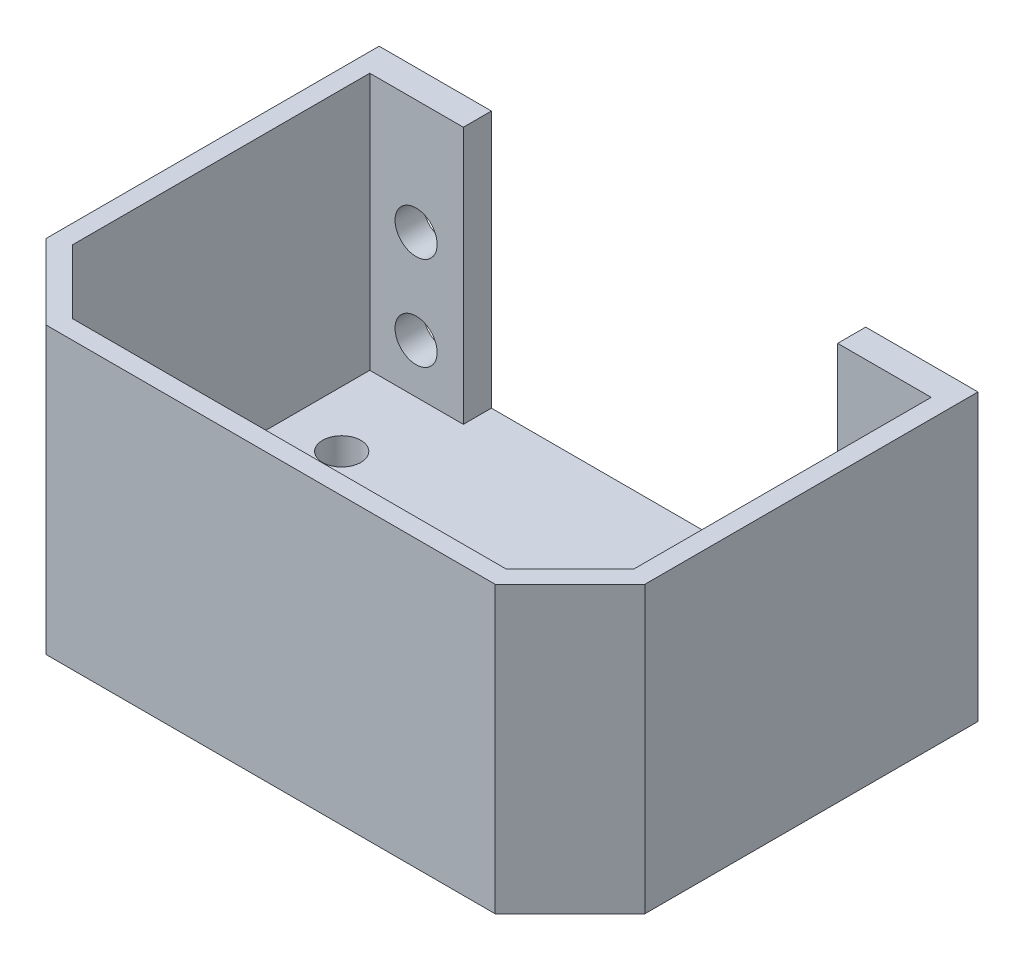
ISO-10303-21;
HEADER;
FILE_DESCRIPTION(('STEP AP214'),'2;1');
FILE_NAME('part.step','',(''),(''),'','','');
FILE_SCHEMA(('AUTOMOTIVE_DESIGN { 1 0 10303 214 1 1 1 1 }'));
ENDSEC;
DATA;
#1=APPLICATION_CONTEXT('core data for automotive mechanical design processes');
#2=APPLICATION_PROTOCOL_DEFINITION('international standard','automotive_design',2000,#1);
#3=PRODUCT_CONTEXT('',#1,'mechanical');
#4=PRODUCT('Part','Part','',(#3));
#5=PRODUCT_RELATED_PRODUCT_CATEGORY('part','',(#4));
#6=PRODUCT_DEFINITION_FORMATION('','',#4);
#7=PRODUCT_DEFINITION_CONTEXT('part definition',#1,'design');
#8=PRODUCT_DEFINITION('design','',#6,#7);
#9=PRODUCT_DEFINITION_SHAPE('','',#8);
#10=(LENGTH_UNIT() NAMED_UNIT(*) SI_UNIT(.MILLI.,.METRE.));
#11=(NAMED_UNIT(*) PLANE_ANGLE_UNIT() SI_UNIT($,.RADIAN.));
#12=(NAMED_UNIT(*) SI_UNIT($,.STERADIAN.) SOLID_ANGLE_UNIT());
#13=UNCERTAINTY_MEASURE_WITH_UNIT(LENGTH_MEASURE(1.E-05),#10,'distance_accuracy_value','');
#14=(GEOMETRIC_REPRESENTATION_CONTEXT(3) GLOBAL_UNCERTAINTY_ASSIGNED_CONTEXT((#13)) GLOBAL_UNIT_ASSIGNED_CONTEXT((#10,
#11,#12)) REPRESENTATION_CONTEXT('',''));
#15=CARTESIAN_POINT('',(0.,0.,0.));
#16=DIRECTION('',(0.,0.,1.));
#17=DIRECTION('',(1.,0.,0.));
#18=AXIS2_PLACEMENT_3D('',#15,#16,#17);
#19=CARTESIAN_POINT('',(32.,-10.25,28.));
#20=DIRECTION('',(0.,1.,0.));
#21=DIRECTION('',(0.,0.,1.));
#22=AXIS2_PLACEMENT_3D('',#19,#20,#21);
#23=PLANE('',#22);
#24=DIRECTION('',(0.,0.,-1.));
#25=VECTOR('',#24,1.);
#26=CARTESIAN_POINT('',(28.,-10.25,28.));
#27=LINE('',#26,#25);
#28=CARTESIAN_POINT('',(28.,-10.25,26.5142135623731));
#29=VERTEX_POINT('',#28);
#30=CARTESIAN_POINT('',(28.,-10.25,18.1));
#31=VERTEX_POINT('',#30);
#32=EDGE_CURVE('E369',#29,#31,#27,.T.);
#33=ORIENTED_EDGE('',*,*,#32,.F.);
#34=DIRECTION('',(0.707106781186544,0.,-0.70710678118655));
#35=VECTOR('',#34,1.);
#36=CARTESIAN_POINT('',(28.,-10.25,26.5142135623731));
#37=LINE('',#36,#35);
#38=CARTESIAN_POINT('',(25.9142135623731,-10.25,28.6));
#39=VERTEX_POINT('',#38);
#40=EDGE_CURVE('E324',#39,#29,#37,.T.);
#41=ORIENTED_EDGE('',*,*,#40,.F.);
#42=DIRECTION('',(1.,0.,0.));
#43=VECTOR('',#42,1.);
#44=CARTESIAN_POINT('',(25.9142135623731,-10.25,28.6));
#45=LINE('',#44,#43);
#46=CARTESIAN_POINT('',(-5.91421356237307,-10.25,28.6));
#47=VERTEX_POINT('',#46);
#48=EDGE_CURVE('E320',#47,#39,#45,.T.);
#49=ORIENTED_EDGE('',*,*,#48,.F.);
#50=DIRECTION('',(0.70710678118655,0.,0.707106781186545));
#51=VECTOR('',#50,1.);
#52=CARTESIAN_POINT('',(-5.91421356237307,-10.25,28.6));
#53=LINE('',#52,#51);
#54=CARTESIAN_POINT('',(-8.,-10.25,26.5142135623731));
#55=VERTEX_POINT('',#54);
#56=EDGE_CURVE('E316',#55,#47,#53,.T.);
#57=ORIENTED_EDGE('',*,*,#56,.F.);
#58=DIRECTION('',(0.,0.,1.));
#59=VECTOR('',#58,1.);
#60=CARTESIAN_POINT('',(-8.,-10.25,28.));
#61=LINE('',#60,#59);
#62=CARTESIAN_POINT('',(-8.,-10.25,18.1));
#63=VERTEX_POINT('',#62);
#64=EDGE_CURVE('E373',#63,#55,#61,.T.);
#65=ORIENTED_EDGE('',*,*,#64,.F.);
#66=DIRECTION('',(0.707106781186543,0.,-0.707106781186552));
#67=VECTOR('',#66,1.);
#68=CARTESIAN_POINT('',(-8.,-10.25,18.1));
#69=LINE('',#68,#67);
#70=CARTESIAN_POINT('',(-5.5,-10.25,15.6));
#71=VERTEX_POINT('',#70);
#72=EDGE_CURVE('E497',#63,#71,#69,.T.);
#73=ORIENTED_EDGE('',*,*,#72,.T.);
#74=DIRECTION('',(1.,0.,0.));
#75=VECTOR('',#74,1.);
#76=CARTESIAN_POINT('',(28.,-10.25,15.6));
#77=LINE('',#76,#75);
#78=CARTESIAN_POINT('',(25.5,-10.25,15.6));
#79=VERTEX_POINT('',#78);
#80=EDGE_CURVE('E351',#71,#79,#77,.T.);
#81=ORIENTED_EDGE('',*,*,#80,.T.);
#82=DIRECTION('',(0.707106781186551,0.,0.707106781186544));
#83=VECTOR('',#82,1.);
#84=CARTESIAN_POINT('',(25.5,-10.25,15.6));
#85=LINE('',#84,#83);
#86=EDGE_CURVE('E503',#79,#31,#85,.T.);
#87=ORIENTED_EDGE('',*,*,#86,.T.);
#88=EDGE_LOOP('',(#33,#41,#49,#57,#65,#73,#81,#87));
#89=FACE_BOUND('',#88,.T.);
#90=CARTESIAN_POINT('',(-24.,-10.25,31.6));
#91=DIRECTION('',(0.,-1.,0.));
#92=DIRECTION('',(0.,0.,-1.));
#93=AXIS2_PLACEMENT_3D('',#90,#91,#92);
#94=CIRCLE('',#93,2.05);
#95=CARTESIAN_POINT('',(-24.,-10.25,29.55));
#96=VERTEX_POINT('',#95);
#97=EDGE_CURVE('E343',#96,#96,#94,.T.);
#98=ORIENTED_EDGE('',*,*,#97,.T.);
#99=EDGE_LOOP('',(#98));
#100=FACE_BOUND('',#99,.T.);
#101=CARTESIAN_POINT('',(24.,-10.25,33.6));
#102=DIRECTION('',(0.,-1.,0.));
#103=DIRECTION('',(0.,0.,-1.));
#104=AXIS2_PLACEMENT_3D('',#101,#102,#103);
#105=CIRCLE('',#104,2.05);
#106=CARTESIAN_POINT('',(24.,-10.25,31.55));
#107=VERTEX_POINT('',#106);
#108=EDGE_CURVE('E333',#107,#107,#105,.T.);
#109=ORIENTED_EDGE('',*,*,#108,.T.);
#110=EDGE_LOOP('',(#109));
#111=FACE_BOUND('',#110,.T.);
#112=CARTESIAN_POINT('',(-24.,-10.25,12.));
#113=DIRECTION('',(0.,1.,0.));
#114=DIRECTION('',(0.,0.,1.));
#115=AXIS2_PLACEMENT_3D('',#112,#113,#114);
#116=CIRCLE('',#115,2.05);
#117=CARTESIAN_POINT('',(-24.,-10.25,14.05));
#118=VERTEX_POINT('',#117);
#119=EDGE_CURVE('E361',#118,#118,#116,.T.);
#120=ORIENTED_EDGE('',*,*,#119,.F.);
#121=EDGE_LOOP('',(#120));
#122=FACE_BOUND('',#121,.T.);
#123=CARTESIAN_POINT('',(24.,-10.25,10.));
#124=DIRECTION('',(0.,1.,0.));
#125=DIRECTION('',(0.,0.,1.));
#126=AXIS2_PLACEMENT_3D('',#123,#124,#125);
#127=CIRCLE('',#126,2.05);
#128=CARTESIAN_POINT('',(24.,-10.25,12.05));
#129=VERTEX_POINT('',#128);
#130=EDGE_CURVE('E360',#129,#129,#127,.T.);
#131=ORIENTED_EDGE('',*,*,#130,.F.);
#132=EDGE_LOOP('',(#131));
#133=FACE_BOUND('',#132,.T.);
#134=DIRECTION('',(-0.707106781187019,0.,0.707106781186076));
#135=VECTOR('',#134,1.);
#136=CARTESIAN_POINT('',(23.1715728752653,-10.25,41.6));
#137=LINE('',#136,#135);
#138=CARTESIAN_POINT('',(30.0000000000107,-10.25,34.7715728752637));
#139=VERTEX_POINT('',#138);
#140=CARTESIAN_POINT('',(23.1715728752653,-10.25,41.6));
#141=VERTEX_POINT('',#140);
#142=EDGE_CURVE('E301',#139,#141,#137,.T.);
#143=ORIENTED_EDGE('',*,*,#142,.F.);
#144=DIRECTION('',(0.,0.,1.));
#145=VECTOR('',#144,1.);
#146=CARTESIAN_POINT('',(30.,-10.25,28.));
#147=LINE('',#146,#145);
#148=CARTESIAN_POINT('',(30.,-10.25,3.));
#149=VERTEX_POINT('',#148);
#150=EDGE_CURVE('E61',#149,#139,#147,.T.);
#151=ORIENTED_EDGE('',*,*,#150,.F.);
#152=DIRECTION('',(-1.,0.,0.));
#153=VECTOR('',#152,1.);
#154=CARTESIAN_POINT('',(0.,-10.25,3.));
#155=LINE('',#154,#153);
#156=CARTESIAN_POINT('',(20.,-10.25,3.));
#157=VERTEX_POINT('',#156);
#158=EDGE_CURVE('E416',#149,#157,#155,.T.);
#159=ORIENTED_EDGE('',*,*,#158,.T.);
#160=DIRECTION('',(0.,0.,-1.));
#161=VECTOR('',#160,1.);
#162=CARTESIAN_POINT('',(20.,-10.25,3.));
#163=LINE('',#162,#161);
#164=CARTESIAN_POINT('',(20.,-10.25,0.));
#165=VERTEX_POINT('',#164);
#166=EDGE_CURVE('E419',#157,#165,#163,.T.);
#167=ORIENTED_EDGE('',*,*,#166,.T.);
#168=DIRECTION('',(1.,0.,0.));
#169=VECTOR('',#168,1.);
#170=CARTESIAN_POINT('',(32.,-10.25,0.));
#171=LINE('',#170,#169);
#172=CARTESIAN_POINT('',(-20.,-10.25,0.));
#173=VERTEX_POINT('',#172);
#174=EDGE_CURVE('E432',#173,#165,#171,.T.);
#175=ORIENTED_EDGE('',*,*,#174,.F.);
#176=DIRECTION('',(0.,0.,-1.));
#177=VECTOR('',#176,1.);
#178=CARTESIAN_POINT('',(-20.,-10.25,3.));
#179=LINE('',#178,#177);
#180=CARTESIAN_POINT('',(-20.,-10.25,3.));
#181=VERTEX_POINT('',#180);
#182=EDGE_CURVE('E212',#181,#173,#179,.T.);
#183=ORIENTED_EDGE('',*,*,#182,.F.);
#184=DIRECTION('',(-1.,0.,0.));
#185=VECTOR('',#184,1.);
#186=CARTESIAN_POINT('',(0.,-10.25,3.));
#187=LINE('',#186,#185);
#188=CARTESIAN_POINT('',(-30.,-10.25,3.));
#189=VERTEX_POINT('',#188);
#190=EDGE_CURVE('E459',#181,#189,#187,.T.);
#191=ORIENTED_EDGE('',*,*,#190,.T.);
#192=DIRECTION('',(0.,0.,1.));
#193=VECTOR('',#192,1.);
#194=CARTESIAN_POINT('',(-30.,-10.25,28.));
#195=LINE('',#194,#193);
#196=CARTESIAN_POINT('',(-30.,-10.25,34.7715728752538));
#197=VERTEX_POINT('',#196);
#198=EDGE_CURVE('E392',#189,#197,#195,.T.);
#199=ORIENTED_EDGE('',*,*,#198,.T.);
#200=DIRECTION('',(-0.707106781186547,0.,-0.707106781186547));
#201=VECTOR('',#200,1.);
#202=CARTESIAN_POINT('',(-30.,-10.25,34.7715728752538));
#203=LINE('',#202,#201);
#204=CARTESIAN_POINT('',(-23.1715728752538,-10.25,41.6));
#205=VERTEX_POINT('',#204);
#206=EDGE_CURVE('E292',#205,#197,#203,.T.);
#207=ORIENTED_EDGE('',*,*,#206,.F.);
#208=DIRECTION('',(-1.,0.,0.));
#209=VECTOR('',#208,1.);
#210=CARTESIAN_POINT('',(-23.1715728752538,-10.25,41.6));
#211=LINE('',#210,#209);
#212=EDGE_CURVE('E68',#141,#205,#211,.T.);
#213=ORIENTED_EDGE('',*,*,#212,.F.);
#214=EDGE_LOOP('',(#143,#151,#159,#167,#175,#183,#191,#199,#207,#213));
#215=FACE_BOUND('',#214,.T.);
#216=ADVANCED_FACE('F44',(#89,#100,#111,#122,#133,#215),#23,.T.);
#217=CARTESIAN_POINT('',(32.,-13.25,28.));
#218=DIRECTION('',(0.,-1.,0.));
#219=DIRECTION('',(0.,0.,-1.));
#220=AXIS2_PLACEMENT_3D('',#217,#218,#219);
#221=PLANE('',#220);
#222=DIRECTION('',(-0.707106781186545,0.,0.70710678118655));
#223=VECTOR('',#222,1.);
#224=CARTESIAN_POINT('',(29.2571067811865,-13.25,25.2571067811866));
#225=LINE('',#224,#223);
#226=CARTESIAN_POINT('',(28.,-13.25,26.5142135623731));
#227=VERTEX_POINT('',#226);
#228=CARTESIAN_POINT('',(25.9142135623731,-13.25,28.6));
#229=VERTEX_POINT('',#228);
#230=EDGE_CURVE('E11',#227,#229,#225,.T.);
#231=ORIENTED_EDGE('',*,*,#230,.F.);
#232=DIRECTION('',(0.,0.,1.));
#233=VECTOR('',#232,1.);
#234=CARTESIAN_POINT('',(28.,-13.25,28.));
#235=LINE('',#234,#233);
#236=CARTESIAN_POINT('',(28.,-13.25,18.1));
#237=VERTEX_POINT('',#236);
#238=EDGE_CURVE('E381',#237,#227,#235,.T.);
#239=ORIENTED_EDGE('',*,*,#238,.F.);
#240=DIRECTION('',(-0.707106781186551,0.,-0.707106781186544));
#241=VECTOR('',#240,1.);
#242=CARTESIAN_POINT('',(25.5,-13.25,15.6));
#243=LINE('',#242,#241);
#244=CARTESIAN_POINT('',(25.5,-13.25,15.6));
#245=VERTEX_POINT('',#244);
#246=EDGE_CURVE('E506',#237,#245,#243,.T.);
#247=ORIENTED_EDGE('',*,*,#246,.T.);
#248=DIRECTION('',(-1.,0.,0.));
#249=VECTOR('',#248,1.);
#250=CARTESIAN_POINT('',(32.,-13.25,15.6));
#251=LINE('',#250,#249);
#252=CARTESIAN_POINT('',(-5.5,-13.25,15.6));
#253=VERTEX_POINT('',#252);
#254=EDGE_CURVE('E467',#245,#253,#251,.T.);
#255=ORIENTED_EDGE('',*,*,#254,.T.);
#256=DIRECTION('',(-0.707106781186543,0.,0.707106781186552));
#257=VECTOR('',#256,1.);
#258=CARTESIAN_POINT('',(-8.,-13.25,18.1));
#259=LINE('',#258,#257);
#260=CARTESIAN_POINT('',(-8.,-13.25,18.1));
#261=VERTEX_POINT('',#260);
#262=EDGE_CURVE('E500',#253,#261,#259,.T.);
#263=ORIENTED_EDGE('',*,*,#262,.T.);
#264=DIRECTION('',(0.,0.,-1.));
#265=VECTOR('',#264,1.);
#266=CARTESIAN_POINT('',(-8.,-13.25,28.));
#267=LINE('',#266,#265);
#268=CARTESIAN_POINT('',(-8.,-13.25,26.5142135623731));
#269=VERTEX_POINT('',#268);
#270=EDGE_CURVE('E377',#269,#261,#267,.T.);
#271=ORIENTED_EDGE('',*,*,#270,.F.);
#272=DIRECTION('',(-0.70710678118655,0.,-0.707106781186545));
#273=VECTOR('',#272,1.);
#274=CARTESIAN_POINT('',(12.7428932188136,-13.25,47.2571067811865));
#275=LINE('',#274,#273);
#276=CARTESIAN_POINT('',(-5.91421356237307,-13.25,28.6));
#277=VERTEX_POINT('',#276);
#278=EDGE_CURVE('E527',#277,#269,#275,.T.);
#279=ORIENTED_EDGE('',*,*,#278,.F.);
#280=DIRECTION('',(-1.,0.,0.));
#281=VECTOR('',#280,1.);
#282=CARTESIAN_POINT('',(32.,-13.25,28.6));
#283=LINE('',#282,#281);
#284=EDGE_CURVE('E54',#229,#277,#283,.T.);
#285=ORIENTED_EDGE('',*,*,#284,.F.);
#286=EDGE_LOOP('',(#231,#239,#247,#255,#263,#271,#279,#285));
#287=FACE_BOUND('',#286,.T.);
#288=CARTESIAN_POINT('',(-24.,-13.25,31.6));
#289=DIRECTION('',(0.,-1.,0.));
#290=DIRECTION('',(0.,0.,-1.));
#291=AXIS2_PLACEMENT_3D('',#288,#289,#290);
#292=CIRCLE('',#291,2.05);
#293=CARTESIAN_POINT('',(-24.,-13.25,29.55));
#294=VERTEX_POINT('',#293);
#295=EDGE_CURVE('E356',#294,#294,#292,.F.);
#296=ORIENTED_EDGE('',*,*,#295,.T.);
#297=EDGE_LOOP('',(#296));
#298=FACE_BOUND('',#297,.T.);
#299=CARTESIAN_POINT('',(24.,-13.25,33.6));
#300=DIRECTION('',(0.,-1.,0.));
#301=DIRECTION('',(0.,0.,-1.));
#302=AXIS2_PLACEMENT_3D('',#299,#300,#301);
#303=CIRCLE('',#302,2.05);
#304=CARTESIAN_POINT('',(24.,-13.25,31.55));
#305=VERTEX_POINT('',#304);
#306=EDGE_CURVE('E347',#305,#305,#303,.F.);
#307=ORIENTED_EDGE('',*,*,#306,.T.);
#308=EDGE_LOOP('',(#307));
#309=FACE_BOUND('',#308,.T.);
#310=DIRECTION('',(1.,0.,0.));
#311=VECTOR('',#310,1.);
#312=CARTESIAN_POINT('',(-32.,-13.25,43.6));
#313=LINE('',#312,#311);
#314=CARTESIAN_POINT('',(-24.,-13.25,43.6));
#315=VERTEX_POINT('',#314);
#316=CARTESIAN_POINT('',(24.0000000000107,-13.25,43.6));
#317=VERTEX_POINT('',#316);
#318=EDGE_CURVE('E355',#315,#317,#313,.T.);
#319=ORIENTED_EDGE('',*,*,#318,.F.);
#320=DIRECTION('',(0.707106781186549,0.,0.707106781186547));
#321=VECTOR('',#320,1.);
#322=CARTESIAN_POINT('',(-3.79999999999991,-13.25,63.8));
#323=LINE('',#322,#321);
#324=CARTESIAN_POINT('',(-32.,-13.25,35.6));
#325=VERTEX_POINT('',#324);
#326=EDGE_CURVE('E521',#315,#325,#323,.F.);
#327=ORIENTED_EDGE('',*,*,#326,.T.);
#328=DIRECTION('',(0.,0.,-1.));
#329=VECTOR('',#328,1.);
#330=CARTESIAN_POINT('',(-32.,-13.25,28.));
#331=LINE('',#330,#329);
#332=CARTESIAN_POINT('',(-32.,-13.25,0.));
#333=VERTEX_POINT('',#332);
#334=EDGE_CURVE('E436',#325,#333,#331,.T.);
#335=ORIENTED_EDGE('',*,*,#334,.T.);
#336=DIRECTION('',(-1.,0.,0.));
#337=VECTOR('',#336,1.);
#338=CARTESIAN_POINT('',(32.,-13.25,0.));
#339=LINE('',#338,#337);
#340=CARTESIAN_POINT('',(32.,-13.25,0.));
#341=VERTEX_POINT('',#340);
#342=EDGE_CURVE('E429',#341,#333,#339,.T.);
#343=ORIENTED_EDGE('',*,*,#342,.F.);
#344=DIRECTION('',(0.,0.,-1.));
#345=VECTOR('',#344,1.);
#346=CARTESIAN_POINT('',(32.,-13.25,28.));
#347=LINE('',#346,#345);
#348=CARTESIAN_POINT('',(32.,-13.25,35.6000000000107));
#349=VERTEX_POINT('',#348);
#350=EDGE_CURVE('E435',#349,#341,#347,.T.);
#351=ORIENTED_EDGE('',*,*,#350,.F.);
#352=DIRECTION('',(0.707106781186547,0.,-0.707106781186548));
#353=VECTOR('',#352,1.);
#354=CARTESIAN_POINT('',(35.8000000000053,-13.25,31.8000000000053));
#355=LINE('',#354,#353);
#356=EDGE_CURVE('E518',#349,#317,#355,.F.);
#357=ORIENTED_EDGE('',*,*,#356,.T.);
#358=EDGE_LOOP('',(#319,#327,#335,#343,#351,#357));
#359=FACE_BOUND('',#358,.T.);
#360=CARTESIAN_POINT('',(-24.,-13.25,12.));
#361=DIRECTION('',(0.,-1.,0.));
#362=DIRECTION('',(0.,0.,-1.));
#363=AXIS2_PLACEMENT_3D('',#360,#361,#362);
#364=CIRCLE('',#363,2.05);
#365=CARTESIAN_POINT('',(-24.,-13.25,9.95));
#366=VERTEX_POINT('',#365);
#367=EDGE_CURVE('E374',#366,#366,#364,.T.);
#368=ORIENTED_EDGE('',*,*,#367,.F.);
#369=EDGE_LOOP('',(#368));
#370=FACE_BOUND('',#369,.T.);
#371=CARTESIAN_POINT('',(24.,-13.25,10.));
#372=DIRECTION('',(0.,-1.,0.));
#373=DIRECTION('',(0.,0.,-1.));
#374=AXIS2_PLACEMENT_3D('',#371,#372,#373);
#375=CIRCLE('',#374,2.05);
#376=CARTESIAN_POINT('',(24.,-13.25,7.95));
#377=VERTEX_POINT('',#376);
#378=EDGE_CURVE('E365',#377,#377,#375,.T.);
#379=ORIENTED_EDGE('',*,*,#378,.F.);
#380=EDGE_LOOP('',(#379));
#381=FACE_BOUND('',#380,.T.);
#382=ADVANCED_FACE('F544',(#287,#298,#309,#359,#370,#381),#221,.T.);
#383=CARTESIAN_POINT('',(0.,0.,3.));
#384=DIRECTION('',(0.,0.,1.));
#385=DIRECTION('',(1.,0.,0.));
#386=AXIS2_PLACEMENT_3D('',#383,#384,#385);
#387=PLANE('',#386);
#388=CARTESIAN_POINT('',(25.05,-5.,3.));
#389=DIRECTION('',(0.,0.,1.));
#390=DIRECTION('',(1.,0.,0.));
#391=AXIS2_PLACEMENT_3D('',#388,#389,#390);
#392=CIRCLE('',#391,2.25);
#393=CARTESIAN_POINT('',(27.3,-5.,3.));
#394=VERTEX_POINT('',#393);
#395=EDGE_CURVE('E407',#394,#394,#392,.F.);
#396=ORIENTED_EDGE('',*,*,#395,.T.);
#397=EDGE_LOOP('',(#396));
#398=FACE_BOUND('',#397,.T.);
#399=CARTESIAN_POINT('',(25.05,5.,3.));
#400=DIRECTION('',(0.,0.,1.));
#401=DIRECTION('',(1.,0.,0.));
#402=AXIS2_PLACEMENT_3D('',#399,#400,#401);
#403=CIRCLE('',#402,2.25);
#404=CARTESIAN_POINT('',(27.3,5.,3.));
#405=VERTEX_POINT('',#404);
#406=EDGE_CURVE('E400',#405,#405,#403,.F.);
#407=ORIENTED_EDGE('',*,*,#406,.T.);
#408=EDGE_LOOP('',(#407));
#409=FACE_BOUND('',#408,.T.);
#410=ORIENTED_EDGE('',*,*,#158,.F.);
#411=DIRECTION('',(0.,-1.,0.));
#412=VECTOR('',#411,1.);
#413=CARTESIAN_POINT('',(30.,-10.25,3.));
#414=LINE('',#413,#412);
#415=CARTESIAN_POINT('',(30.,17.25,3.));
#416=VERTEX_POINT('',#415);
#417=EDGE_CURVE('E384',#416,#149,#414,.T.);
#418=ORIENTED_EDGE('',*,*,#417,.F.);
#419=DIRECTION('',(1.,0.,0.));
#420=VECTOR('',#419,1.);
#421=CARTESIAN_POINT('',(20.,17.25,3.));
#422=LINE('',#421,#420);
#423=CARTESIAN_POINT('',(20.,17.25,3.));
#424=VERTEX_POINT('',#423);
#425=EDGE_CURVE('E266',#424,#416,#422,.T.);
#426=ORIENTED_EDGE('',*,*,#425,.F.);
#427=DIRECTION('',(0.,-1.,0.));
#428=VECTOR('',#427,1.);
#429=CARTESIAN_POINT('',(20.,0.,3.));
#430=LINE('',#429,#428);
#431=EDGE_CURVE('E412',#424,#157,#430,.T.);
#432=ORIENTED_EDGE('',*,*,#431,.T.);
#433=EDGE_LOOP('',(#410,#418,#426,#432));
#434=FACE_BOUND('',#433,.T.);
#435=ADVANCED_FACE('F587',(#398,#409,#434),#387,.T.);
#436=CARTESIAN_POINT('',(0.,0.,3.));
#437=DIRECTION('',(0.,0.,1.));
#438=DIRECTION('',(1.,0.,0.));
#439=AXIS2_PLACEMENT_3D('',#436,#437,#438);
#440=PLANE('',#439);
#441=CARTESIAN_POINT('',(-25.05,5.,3.));
#442=DIRECTION('',(0.,0.,1.));
#443=DIRECTION('',(1.,0.,0.));
#444=AXIS2_PLACEMENT_3D('',#441,#442,#443);
#445=CIRCLE('',#444,2.25);
#446=CARTESIAN_POINT('',(-22.8,5.,3.));
#447=VERTEX_POINT('',#446);
#448=EDGE_CURVE('E218',#447,#447,#445,.T.);
#449=ORIENTED_EDGE('',*,*,#448,.F.);
#450=EDGE_LOOP('',(#449));
#451=FACE_BOUND('',#450,.T.);
#452=CARTESIAN_POINT('',(-25.05,-5.,3.));
#453=DIRECTION('',(0.,0.,1.));
#454=DIRECTION('',(1.,0.,0.));
#455=AXIS2_PLACEMENT_3D('',#452,#453,#454);
#456=CIRCLE('',#455,2.25);
#457=CARTESIAN_POINT('',(-22.8,-5.,3.));
#458=VERTEX_POINT('',#457);
#459=EDGE_CURVE('E446',#458,#458,#456,.T.);
#460=ORIENTED_EDGE('',*,*,#459,.F.);
#461=EDGE_LOOP('',(#460));
#462=FACE_BOUND('',#461,.T.);
#463=DIRECTION('',(0.,-1.,0.));
#464=VECTOR('',#463,1.);
#465=CARTESIAN_POINT('',(-20.,0.,3.));
#466=LINE('',#465,#464);
#467=CARTESIAN_POINT('',(-20.,17.25,3.));
#468=VERTEX_POINT('',#467);
#469=EDGE_CURVE('E456',#468,#181,#466,.T.);
#470=ORIENTED_EDGE('',*,*,#469,.F.);
#471=DIRECTION('',(1.,0.,0.));
#472=VECTOR('',#471,1.);
#473=CARTESIAN_POINT('',(-30.,17.25,3.));
#474=LINE('',#473,#472);
#475=CARTESIAN_POINT('',(-30.,17.25,3.));
#476=VERTEX_POINT('',#475);
#477=EDGE_CURVE('E236',#476,#468,#474,.T.);
#478=ORIENTED_EDGE('',*,*,#477,.F.);
#479=DIRECTION('',(0.,-1.,0.));
#480=VECTOR('',#479,1.);
#481=CARTESIAN_POINT('',(-30.,-10.25,3.));
#482=LINE('',#481,#480);
#483=EDGE_CURVE('E389',#476,#189,#482,.T.);
#484=ORIENTED_EDGE('',*,*,#483,.T.);
#485=ORIENTED_EDGE('',*,*,#190,.F.);
#486=EDGE_LOOP('',(#470,#478,#484,#485));
#487=FACE_BOUND('',#486,.T.);
#488=ADVANCED_FACE('F605',(#451,#462,#487),#440,.T.);
#489=CARTESIAN_POINT('',(-20.,0.,3.));
#490=DIRECTION('',(1.,0.,0.));
#491=DIRECTION('',(0.,0.,-1.));
#492=AXIS2_PLACEMENT_3D('',#489,#490,#491);
#493=PLANE('',#492);
#494=DIRECTION('',(0.,-1.,0.));
#495=VECTOR('',#494,1.);
#496=CARTESIAN_POINT('',(-20.,0.,0.));
#497=LINE('',#496,#495);
#498=CARTESIAN_POINT('',(-20.,17.25,0.));
#499=VERTEX_POINT('',#498);
#500=EDGE_CURVE('E206',#499,#173,#497,.T.);
#501=ORIENTED_EDGE('',*,*,#500,.F.);
#502=DIRECTION('',(0.,0.,-1.));
#503=VECTOR('',#502,1.);
#504=CARTESIAN_POINT('',(-20.,17.25,3.));
#505=LINE('',#504,#503);
#506=EDGE_CURVE('E210',#468,#499,#505,.T.);
#507=ORIENTED_EDGE('',*,*,#506,.F.);
#508=ORIENTED_EDGE('',*,*,#469,.T.);
#509=ORIENTED_EDGE('',*,*,#182,.T.);
#510=EDGE_LOOP('',(#501,#507,#508,#509));
#511=FACE_BOUND('',#510,.T.);
#512=ADVANCED_FACE('F208',(#511),#493,.T.);
#513=CARTESIAN_POINT('',(-32.,0.,3.));
#514=DIRECTION('',(-1.,0.,0.));
#515=DIRECTION('',(0.,0.,1.));
#516=AXIS2_PLACEMENT_3D('',#513,#514,#515);
#517=PLANE('',#516);
#518=DIRECTION('',(0.,1.,0.));
#519=VECTOR('',#518,1.);
#520=CARTESIAN_POINT('',(-32.,0.,35.6));
#521=LINE('',#520,#519);
#522=CARTESIAN_POINT('',(-32.,17.25,35.6));
#523=VERTEX_POINT('',#522);
#524=EDGE_CURVE('E509',#325,#523,#521,.T.);
#525=ORIENTED_EDGE('',*,*,#524,.T.);
#526=DIRECTION('',(0.,0.,1.));
#527=VECTOR('',#526,1.);
#528=CARTESIAN_POINT('',(-32.,17.25,0.));
#529=LINE('',#528,#527);
#530=CARTESIAN_POINT('',(-32.,17.25,0.));
#531=VERTEX_POINT('',#530);
#532=EDGE_CURVE('E230',#531,#523,#529,.T.);
#533=ORIENTED_EDGE('',*,*,#532,.F.);
#534=DIRECTION('',(0.,1.,0.));
#535=VECTOR('',#534,1.);
#536=CARTESIAN_POINT('',(-32.,0.,0.));
#537=LINE('',#536,#535);
#538=EDGE_CURVE('E217',#333,#531,#537,.T.);
#539=ORIENTED_EDGE('',*,*,#538,.F.);
#540=ORIENTED_EDGE('',*,*,#334,.F.);
#541=EDGE_LOOP('',(#525,#533,#539,#540));
#542=FACE_BOUND('',#541,.T.);
#543=ADVANCED_FACE('F611',(#542),#517,.T.);
#544=CARTESIAN_POINT('',(0.,0.,0.));
#545=DIRECTION('',(0.,0.,1.));
#546=DIRECTION('',(1.,0.,0.));
#547=AXIS2_PLACEMENT_3D('',#544,#545,#546);
#548=PLANE('',#547);
#549=CARTESIAN_POINT('',(-25.05,5.,0.));
#550=DIRECTION('',(0.,0.,1.));
#551=DIRECTION('',(1.,0.,0.));
#552=AXIS2_PLACEMENT_3D('',#549,#550,#551);
#553=CIRCLE('',#552,2.25);
#554=CARTESIAN_POINT('',(-22.8,5.,0.));
#555=VERTEX_POINT('',#554);
#556=EDGE_CURVE('E442',#555,#555,#553,.T.);
#557=ORIENTED_EDGE('',*,*,#556,.T.);
#558=EDGE_LOOP('',(#557));
#559=FACE_BOUND('',#558,.T.);
#560=CARTESIAN_POINT('',(-25.05,-5.,0.));
#561=DIRECTION('',(0.,0.,1.));
#562=DIRECTION('',(1.,0.,0.));
#563=AXIS2_PLACEMENT_3D('',#560,#561,#562);
#564=CIRCLE('',#563,2.25);
#565=CARTESIAN_POINT('',(-22.8,-5.,0.));
#566=VERTEX_POINT('',#565);
#567=EDGE_CURVE('E439',#566,#566,#564,.T.);
#568=ORIENTED_EDGE('',*,*,#567,.T.);
#569=EDGE_LOOP('',(#568));
#570=FACE_BOUND('',#569,.T.);
#571=ORIENTED_EDGE('',*,*,#500,.T.);
#572=ORIENTED_EDGE('',*,*,#174,.T.);
#573=DIRECTION('',(0.,-1.,0.));
#574=VECTOR('',#573,1.);
#575=CARTESIAN_POINT('',(20.,0.,0.));
#576=LINE('',#575,#574);
#577=CARTESIAN_POINT('',(20.,17.25,0.));
#578=VERTEX_POINT('',#577);
#579=EDGE_CURVE('E411',#578,#165,#576,.T.);
#580=ORIENTED_EDGE('',*,*,#579,.F.);
#581=DIRECTION('',(-1.,0.,0.));
#582=VECTOR('',#581,1.);
#583=CARTESIAN_POINT('',(32.,17.25,0.));
#584=LINE('',#583,#582);
#585=CARTESIAN_POINT('',(32.,17.25,0.));
#586=VERTEX_POINT('',#585);
#587=EDGE_CURVE('E258',#586,#578,#584,.T.);
#588=ORIENTED_EDGE('',*,*,#587,.F.);
#589=DIRECTION('',(0.,-1.,0.));
#590=VECTOR('',#589,1.);
#591=CARTESIAN_POINT('',(32.,-10.25,0.));
#592=LINE('',#591,#590);
#593=EDGE_CURVE('E425',#586,#341,#592,.T.);
#594=ORIENTED_EDGE('',*,*,#593,.T.);
#595=ORIENTED_EDGE('',*,*,#342,.T.);
#596=ORIENTED_EDGE('',*,*,#538,.T.);
#597=DIRECTION('',(-1.,0.,0.));
#598=VECTOR('',#597,1.);
#599=CARTESIAN_POINT('',(-20.,17.25,0.));
#600=LINE('',#599,#598);
#601=EDGE_CURVE('E221',#499,#531,#600,.T.);
#602=ORIENTED_EDGE('',*,*,#601,.F.);
#603=EDGE_LOOP('',(#571,#572,#580,#588,#594,#595,#596,#602));
#604=FACE_BOUND('',#603,.T.);
#605=CARTESIAN_POINT('',(25.05,-5.,0.));
#606=DIRECTION('',(0.,0.,1.));
#607=DIRECTION('',(1.,0.,0.));
#608=AXIS2_PLACEMENT_3D('',#605,#606,#607);
#609=CIRCLE('',#608,2.25);
#610=CARTESIAN_POINT('',(27.3,-5.,0.));
#611=VERTEX_POINT('',#610);
#612=EDGE_CURVE('E396',#611,#611,#609,.F.);
#613=ORIENTED_EDGE('',*,*,#612,.F.);
#614=EDGE_LOOP('',(#613));
#615=FACE_BOUND('',#614,.T.);
#616=CARTESIAN_POINT('',(25.05,5.,0.));
#617=DIRECTION('',(0.,0.,1.));
#618=DIRECTION('',(1.,0.,0.));
#619=AXIS2_PLACEMENT_3D('',#616,#617,#618);
#620=CIRCLE('',#619,2.25);
#621=CARTESIAN_POINT('',(27.3,5.,0.));
#622=VERTEX_POINT('',#621);
#623=EDGE_CURVE('E395',#622,#622,#620,.F.);
#624=ORIENTED_EDGE('',*,*,#623,.F.);
#625=EDGE_LOOP('',(#624));
#626=FACE_BOUND('',#625,.T.);
#627=ADVANCED_FACE('F222',(#559,#570,#604,#615,#626),#548,.F.);
#628=CARTESIAN_POINT('',(-25.05,-5.,0.));
#629=DIRECTION('',(0.,0.,1.));
#630=DIRECTION('',(1.,0.,0.));
#631=AXIS2_PLACEMENT_3D('',#628,#629,#630);
#632=CYLINDRICAL_SURFACE('',#631,2.25);
#633=ORIENTED_EDGE('',*,*,#459,.T.);
#634=EDGE_LOOP('',(#633));
#635=FACE_BOUND('',#634,.T.);
#636=ORIENTED_EDGE('',*,*,#567,.F.);
#637=EDGE_LOOP('',(#636));
#638=FACE_BOUND('',#637,.T.);
#639=ADVANCED_FACE('F600',(#635,#638),#632,.F.);
#640=CARTESIAN_POINT('',(-25.05,5.,0.));
#641=DIRECTION('',(0.,0.,1.));
#642=DIRECTION('',(1.,0.,0.));
#643=AXIS2_PLACEMENT_3D('',#640,#641,#642);
#644=CYLINDRICAL_SURFACE('',#643,2.25);
#645=ORIENTED_EDGE('',*,*,#448,.T.);
#646=EDGE_LOOP('',(#645));
#647=FACE_BOUND('',#646,.T.);
#648=ORIENTED_EDGE('',*,*,#556,.F.);
#649=EDGE_LOOP('',(#648));
#650=FACE_BOUND('',#649,.T.);
#651=ADVANCED_FACE('F596',(#647,#650),#644,.F.);
#652=CARTESIAN_POINT('',(32.,-10.25,28.));
#653=DIRECTION('',(1.,0.,0.));
#654=DIRECTION('',(0.,0.,-1.));
#655=AXIS2_PLACEMENT_3D('',#652,#653,#654);
#656=PLANE('',#655);
#657=ORIENTED_EDGE('',*,*,#593,.F.);
#658=DIRECTION('',(-3.00165635168931E-13,0.,-1.));
#659=VECTOR('',#658,1.);
#660=CARTESIAN_POINT('',(32.0000000000107,17.25,35.6000000000107));
#661=LINE('',#660,#659);
#662=CARTESIAN_POINT('',(32.0000000000107,17.25,35.6000000000107));
#663=VERTEX_POINT('',#662);
#664=EDGE_CURVE('E254',#663,#586,#661,.T.);
#665=ORIENTED_EDGE('',*,*,#664,.F.);
#666=DIRECTION('',(0.,-1.,0.));
#667=VECTOR('',#666,1.);
#668=CARTESIAN_POINT('',(32.,-10.25,35.6000000000107));
#669=LINE('',#668,#667);
#670=EDGE_CURVE('E524',#663,#349,#669,.T.);
#671=ORIENTED_EDGE('',*,*,#670,.T.);
#672=ORIENTED_EDGE('',*,*,#350,.T.);
#673=EDGE_LOOP('',(#657,#665,#671,#672));
#674=FACE_BOUND('',#673,.T.);
#675=ADVANCED_FACE('F593',(#674),#656,.T.);
#676=CARTESIAN_POINT('',(20.,0.,3.));
#677=DIRECTION('',(1.,0.,0.));
#678=DIRECTION('',(0.,0.,-1.));
#679=AXIS2_PLACEMENT_3D('',#676,#677,#678);
#680=PLANE('',#679);
#681=ORIENTED_EDGE('',*,*,#579,.T.);
#682=ORIENTED_EDGE('',*,*,#166,.F.);
#683=ORIENTED_EDGE('',*,*,#431,.F.);
#684=DIRECTION('',(0.,0.,1.));
#685=VECTOR('',#684,1.);
#686=CARTESIAN_POINT('',(20.,17.25,0.));
#687=LINE('',#686,#685);
#688=EDGE_CURVE('E262',#578,#424,#687,.T.);
#689=ORIENTED_EDGE('',*,*,#688,.F.);
#690=EDGE_LOOP('',(#681,#682,#683,#689));
#691=FACE_BOUND('',#690,.T.);
#692=ADVANCED_FACE('F590',(#691),#680,.F.);
#693=CARTESIAN_POINT('',(25.05,5.,0.));
#694=DIRECTION('',(0.,0.,1.));
#695=DIRECTION('',(1.,0.,0.));
#696=AXIS2_PLACEMENT_3D('',#693,#694,#695);
#697=CYLINDRICAL_SURFACE('',#696,2.25);
#698=ORIENTED_EDGE('',*,*,#406,.F.);
#699=EDGE_LOOP('',(#698));
#700=FACE_BOUND('',#699,.T.);
#701=ORIENTED_EDGE('',*,*,#623,.T.);
#702=EDGE_LOOP('',(#701));
#703=FACE_BOUND('',#702,.T.);
#704=ADVANCED_FACE('F683',(#700,#703),#697,.F.);
#705=CARTESIAN_POINT('',(25.05,-5.,0.));
#706=DIRECTION('',(0.,0.,1.));
#707=DIRECTION('',(1.,0.,0.));
#708=AXIS2_PLACEMENT_3D('',#705,#706,#707);
#709=CYLINDRICAL_SURFACE('',#708,2.25);
#710=ORIENTED_EDGE('',*,*,#395,.F.);
#711=EDGE_LOOP('',(#710));
#712=FACE_BOUND('',#711,.T.);
#713=ORIENTED_EDGE('',*,*,#612,.T.);
#714=EDGE_LOOP('',(#713));
#715=FACE_BOUND('',#714,.T.);
#716=ADVANCED_FACE('F676',(#712,#715),#709,.F.);
#717=CARTESIAN_POINT('',(-30.,0.,0.));
#718=DIRECTION('',(-1.,0.,0.));
#719=DIRECTION('',(0.,0.,1.));
#720=AXIS2_PLACEMENT_3D('',#717,#718,#719);
#721=PLANE('',#720);
#722=ORIENTED_EDGE('',*,*,#483,.F.);
#723=DIRECTION('',(0.,0.,-1.));
#724=VECTOR('',#723,1.);
#725=CARTESIAN_POINT('',(-30.,17.25,34.7715728752538));
#726=LINE('',#725,#724);
#727=CARTESIAN_POINT('',(-30.,17.25,34.7715728752538));
#728=VERTEX_POINT('',#727);
#729=EDGE_CURVE('E286',#728,#476,#726,.T.);
#730=ORIENTED_EDGE('',*,*,#729,.F.);
#731=DIRECTION('',(0.,-1.,0.));
#732=VECTOR('',#731,1.);
#733=CARTESIAN_POINT('',(-30.,86.0415562579458,34.7715728752538));
#734=LINE('',#733,#732);
#735=EDGE_CURVE('E296',#728,#197,#734,.T.);
#736=ORIENTED_EDGE('',*,*,#735,.T.);
#737=ORIENTED_EDGE('',*,*,#198,.F.);
#738=EDGE_LOOP('',(#722,#730,#736,#737));
#739=FACE_BOUND('',#738,.T.);
#740=ADVANCED_FACE('F671',(#739),#721,.F.);
#741=CARTESIAN_POINT('',(30.,0.,0.));
#742=DIRECTION('',(1.,0.,0.));
#743=DIRECTION('',(0.,0.,1.));
#744=AXIS2_PLACEMENT_3D('',#741,#742,#743);
#745=PLANE('',#744);
#746=DIRECTION('',(0.,-1.,0.));
#747=VECTOR('',#746,1.);
#748=CARTESIAN_POINT('',(30.0000000000107,86.0415562579458,34.7715728752637));
#749=LINE('',#748,#747);
#750=CARTESIAN_POINT('',(30.0000000000107,17.25,34.7715728752637));
#751=VERTEX_POINT('',#750);
#752=EDGE_CURVE('E291',#751,#139,#749,.T.);
#753=ORIENTED_EDGE('',*,*,#752,.F.);
#754=DIRECTION('',(3.36335146326257E-13,0.,1.));
#755=VECTOR('',#754,1.);
#756=CARTESIAN_POINT('',(30.,17.25,3.));
#757=LINE('',#756,#755);
#758=EDGE_CURVE('E270',#416,#751,#757,.T.);
#759=ORIENTED_EDGE('',*,*,#758,.F.);
#760=ORIENTED_EDGE('',*,*,#417,.T.);
#761=ORIENTED_EDGE('',*,*,#150,.T.);
#762=EDGE_LOOP('',(#753,#759,#760,#761));
#763=FACE_BOUND('',#762,.T.);
#764=ADVANCED_FACE('F659',(#763),#745,.F.);
#765=CARTESIAN_POINT('',(28.,-20.25,28.));
#766=DIRECTION('',(1.,0.,0.));
#767=DIRECTION('',(0.,0.,-1.));
#768=AXIS2_PLACEMENT_3D('',#765,#766,#767);
#769=PLANE('',#768);
#770=ORIENTED_EDGE('',*,*,#238,.T.);
#771=DIRECTION('',(0.,1.,0.));
#772=VECTOR('',#771,1.);
#773=CARTESIAN_POINT('',(28.,-20.25,26.5142135623731));
#774=LINE('',#773,#772);
#775=EDGE_CURVE('E329',#227,#29,#774,.T.);
#776=ORIENTED_EDGE('',*,*,#775,.T.);
#777=ORIENTED_EDGE('',*,*,#32,.T.);
#778=DIRECTION('',(0.,-1.,0.));
#779=VECTOR('',#778,1.);
#780=CARTESIAN_POINT('',(28.,-20.25,18.1));
#781=LINE('',#780,#779);
#782=EDGE_CURVE('E477',#31,#237,#781,.T.);
#783=ORIENTED_EDGE('',*,*,#782,.T.);
#784=EDGE_LOOP('',(#770,#776,#777,#783));
#785=FACE_BOUND('',#784,.T.);
#786=ADVANCED_FACE('F567',(#785),#769,.F.);
#787=CARTESIAN_POINT('',(-8.,-20.25,28.));
#788=DIRECTION('',(-1.,0.,0.));
#789=DIRECTION('',(0.,0.,1.));
#790=AXIS2_PLACEMENT_3D('',#787,#788,#789);
#791=PLANE('',#790);
#792=ORIENTED_EDGE('',*,*,#64,.T.);
#793=DIRECTION('',(0.,1.,0.));
#794=VECTOR('',#793,1.);
#795=CARTESIAN_POINT('',(-8.,-20.25,26.5142135623731));
#796=LINE('',#795,#794);
#797=EDGE_CURVE('E328',#269,#55,#796,.T.);
#798=ORIENTED_EDGE('',*,*,#797,.F.);
#799=ORIENTED_EDGE('',*,*,#270,.T.);
#800=DIRECTION('',(0.,1.,0.));
#801=VECTOR('',#800,1.);
#802=CARTESIAN_POINT('',(-8.,-20.25,18.1));
#803=LINE('',#802,#801);
#804=EDGE_CURVE('E486',#261,#63,#803,.T.);
#805=ORIENTED_EDGE('',*,*,#804,.T.);
#806=EDGE_LOOP('',(#792,#798,#799,#805));
#807=FACE_BOUND('',#806,.T.);
#808=ADVANCED_FACE('F549',(#807),#791,.F.);
#809=CARTESIAN_POINT('',(24.,-20.25,10.));
#810=DIRECTION('',(0.,1.,0.));
#811=DIRECTION('',(0.,0.,1.));
#812=AXIS2_PLACEMENT_3D('',#809,#810,#811);
#813=CYLINDRICAL_SURFACE('',#812,2.05);
#814=ORIENTED_EDGE('',*,*,#378,.T.);
#815=EDGE_LOOP('',(#814));
#816=FACE_BOUND('',#815,.T.);
#817=ORIENTED_EDGE('',*,*,#130,.T.);
#818=EDGE_LOOP('',(#817));
#819=FACE_BOUND('',#818,.T.);
#820=ADVANCED_FACE('F751',(#816,#819),#813,.F.);
#821=CARTESIAN_POINT('',(-24.,-20.25,12.));
#822=DIRECTION('',(0.,1.,0.));
#823=DIRECTION('',(0.,0.,1.));
#824=AXIS2_PLACEMENT_3D('',#821,#822,#823);
#825=CYLINDRICAL_SURFACE('',#824,2.05);
#826=ORIENTED_EDGE('',*,*,#367,.T.);
#827=EDGE_LOOP('',(#826));
#828=FACE_BOUND('',#827,.T.);
#829=ORIENTED_EDGE('',*,*,#119,.T.);
#830=EDGE_LOOP('',(#829));
#831=FACE_BOUND('',#830,.T.);
#832=ADVANCED_FACE('F756',(#828,#831),#825,.F.);
#833=CARTESIAN_POINT('',(-32.,-80.86094585939,43.6));
#834=DIRECTION('',(0.,0.,1.));
#835=DIRECTION('',(1.,0.,0.));
#836=AXIS2_PLACEMENT_3D('',#833,#834,#835);
#837=PLANE('',#836);
#838=DIRECTION('',(0.,1.,0.));
#839=VECTOR('',#838,1.);
#840=CARTESIAN_POINT('',(24.0000000000107,-80.86094585939,43.6));
#841=LINE('',#840,#839);
#842=CARTESIAN_POINT('',(24.0000000000107,17.25,43.6));
#843=VERTEX_POINT('',#842);
#844=EDGE_CURVE('E512',#317,#843,#841,.T.);
#845=ORIENTED_EDGE('',*,*,#844,.T.);
#846=DIRECTION('',(1.,0.,0.));
#847=VECTOR('',#846,1.);
#848=CARTESIAN_POINT('',(-24.,17.25,43.6));
#849=LINE('',#848,#847);
#850=CARTESIAN_POINT('',(-24.,17.25,43.6));
#851=VERTEX_POINT('',#850);
#852=EDGE_CURVE('E246',#851,#843,#849,.T.);
#853=ORIENTED_EDGE('',*,*,#852,.F.);
#854=DIRECTION('',(0.,-1.,0.));
#855=VECTOR('',#854,1.);
#856=CARTESIAN_POINT('',(-24.,-80.86094585939,43.6));
#857=LINE('',#856,#855);
#858=EDGE_CURVE('E515',#851,#315,#857,.T.);
#859=ORIENTED_EDGE('',*,*,#858,.T.);
#860=ORIENTED_EDGE('',*,*,#318,.T.);
#861=EDGE_LOOP('',(#845,#853,#859,#860));
#862=FACE_BOUND('',#861,.T.);
#863=ADVANCED_FACE('F650',(#862),#837,.T.);
#864=CARTESIAN_POINT('',(28.,-20.25,15.6));
#865=DIRECTION('',(0.,0.,1.));
#866=DIRECTION('',(1.,0.,0.));
#867=AXIS2_PLACEMENT_3D('',#864,#865,#866);
#868=PLANE('',#867);
#869=ORIENTED_EDGE('',*,*,#80,.F.);
#870=DIRECTION('',(0.,-1.,0.));
#871=VECTOR('',#870,1.);
#872=CARTESIAN_POINT('',(-5.5,-20.25,15.6));
#873=LINE('',#872,#871);
#874=EDGE_CURVE('E494',#71,#253,#873,.T.);
#875=ORIENTED_EDGE('',*,*,#874,.T.);
#876=ORIENTED_EDGE('',*,*,#254,.F.);
#877=DIRECTION('',(0.,1.,0.));
#878=VECTOR('',#877,1.);
#879=CARTESIAN_POINT('',(25.5,-20.25,15.6));
#880=LINE('',#879,#878);
#881=EDGE_CURVE('E490',#245,#79,#880,.T.);
#882=ORIENTED_EDGE('',*,*,#881,.T.);
#883=EDGE_LOOP('',(#869,#875,#876,#882));
#884=FACE_BOUND('',#883,.T.);
#885=ADVANCED_FACE('F558',(#884),#868,.T.);
#886=CARTESIAN_POINT('',(24.,-20.25,33.6));
#887=DIRECTION('',(0.,1.,0.));
#888=DIRECTION('',(0.,0.,1.));
#889=AXIS2_PLACEMENT_3D('',#886,#887,#888);
#890=CYLINDRICAL_SURFACE('',#889,2.05);
#891=ORIENTED_EDGE('',*,*,#306,.F.);
#892=EDGE_LOOP('',(#891));
#893=FACE_BOUND('',#892,.T.);
#894=ORIENTED_EDGE('',*,*,#108,.F.);
#895=EDGE_LOOP('',(#894));
#896=FACE_BOUND('',#895,.T.);
#897=ADVANCED_FACE('F775',(#893,#896),#890,.F.);
#898=CARTESIAN_POINT('',(-24.,-20.25,31.6));
#899=DIRECTION('',(0.,1.,0.));
#900=DIRECTION('',(0.,0.,1.));
#901=AXIS2_PLACEMENT_3D('',#898,#899,#900);
#902=CYLINDRICAL_SURFACE('',#901,2.05);
#903=ORIENTED_EDGE('',*,*,#295,.F.);
#904=EDGE_LOOP('',(#903));
#905=FACE_BOUND('',#904,.T.);
#906=ORIENTED_EDGE('',*,*,#97,.F.);
#907=EDGE_LOOP('',(#906));
#908=FACE_BOUND('',#907,.T.);
#909=ADVANCED_FACE('F624',(#905,#908),#902,.F.);
#910=CARTESIAN_POINT('',(-8.,-20.25,18.1));
#911=DIRECTION('',(-0.707106781186552,0.,-0.707106781186543));
#912=DIRECTION('',(0.,1.,0.));
#913=AXIS2_PLACEMENT_3D('',#910,#911,#912);
#914=PLANE('',#913);
#915=ORIENTED_EDGE('',*,*,#262,.F.);
#916=ORIENTED_EDGE('',*,*,#874,.F.);
#917=ORIENTED_EDGE('',*,*,#72,.F.);
#918=ORIENTED_EDGE('',*,*,#804,.F.);
#919=EDGE_LOOP('',(#915,#916,#917,#918));
#920=FACE_BOUND('',#919,.T.);
#921=ADVANCED_FACE('F552',(#920),#914,.F.);
#922=CARTESIAN_POINT('',(25.5,-20.25,15.6));
#923=DIRECTION('',(0.707106781186543,0.,-0.707106781186551));
#924=DIRECTION('',(0.,1.,0.));
#925=AXIS2_PLACEMENT_3D('',#922,#923,#924);
#926=PLANE('',#925);
#927=ORIENTED_EDGE('',*,*,#246,.F.);
#928=ORIENTED_EDGE('',*,*,#782,.F.);
#929=ORIENTED_EDGE('',*,*,#86,.F.);
#930=ORIENTED_EDGE('',*,*,#881,.F.);
#931=EDGE_LOOP('',(#927,#928,#929,#930));
#932=FACE_BOUND('',#931,.T.);
#933=ADVANCED_FACE('F563',(#932),#926,.F.);
#934=CARTESIAN_POINT('',(-32.,0.,35.6));
#935=DIRECTION('',(0.707106781186547,0.,-0.707106781186549));
#936=DIRECTION('',(0.,1.,0.));
#937=AXIS2_PLACEMENT_3D('',#934,#935,#936);
#938=PLANE('',#937);
#939=ORIENTED_EDGE('',*,*,#326,.F.);
#940=ORIENTED_EDGE('',*,*,#858,.F.);
#941=DIRECTION('',(0.707106781186549,0.,0.707106781186547));
#942=VECTOR('',#941,1.);
#943=CARTESIAN_POINT('',(-32.,17.25,35.6));
#944=LINE('',#943,#942);
#945=EDGE_CURVE('E242',#523,#851,#944,.T.);
#946=ORIENTED_EDGE('',*,*,#945,.F.);
#947=ORIENTED_EDGE('',*,*,#524,.F.);
#948=EDGE_LOOP('',(#939,#940,#946,#947));
#949=FACE_BOUND('',#948,.T.);
#950=ADVANCED_FACE('F579',(#949),#938,.F.);
#951=CARTESIAN_POINT('',(24.0000000000107,-80.86094585939,43.6));
#952=DIRECTION('',(-0.707106781186548,0.,-0.707106781186547));
#953=DIRECTION('',(0.,1.,0.));
#954=AXIS2_PLACEMENT_3D('',#951,#952,#953);
#955=PLANE('',#954);
#956=ORIENTED_EDGE('',*,*,#356,.F.);
#957=ORIENTED_EDGE('',*,*,#670,.F.);
#958=DIRECTION('',(0.707106781187019,0.,-0.707106781186076));
#959=VECTOR('',#958,1.);
#960=CARTESIAN_POINT('',(24.0000000000107,17.25,43.6));
#961=LINE('',#960,#959);
#962=EDGE_CURVE('E250',#843,#663,#961,.T.);
#963=ORIENTED_EDGE('',*,*,#962,.F.);
#964=ORIENTED_EDGE('',*,*,#844,.F.);
#965=EDGE_LOOP('',(#956,#957,#963,#964));
#966=FACE_BOUND('',#965,.T.);
#967=ADVANCED_FACE('F47',(#966),#955,.F.);
#968=CARTESIAN_POINT('',(28.,-20.25,26.5142135623731));
#969=DIRECTION('',(0.70710678118655,0.,0.707106781186544));
#970=DIRECTION('',(0.707106781186545,0.,-0.70710678118655));
#971=AXIS2_PLACEMENT_3D('',#968,#969,#970);
#972=PLANE('',#971);
#973=ORIENTED_EDGE('',*,*,#230,.T.);
#974=DIRECTION('',(0.,1.,0.));
#975=VECTOR('',#974,1.);
#976=CARTESIAN_POINT('',(25.9142135623731,-20.25,28.6));
#977=LINE('',#976,#975);
#978=EDGE_CURVE('E334',#229,#39,#977,.T.);
#979=ORIENTED_EDGE('',*,*,#978,.T.);
#980=ORIENTED_EDGE('',*,*,#40,.T.);
#981=ORIENTED_EDGE('',*,*,#775,.F.);
#982=EDGE_LOOP('',(#973,#979,#980,#981));
#983=FACE_BOUND('',#982,.T.);
#984=ADVANCED_FACE('F571',(#983),#972,.F.);
#985=CARTESIAN_POINT('',(25.9142135623731,-20.25,28.6));
#986=DIRECTION('',(0.,0.,1.));
#987=DIRECTION('',(1.,0.,0.));
#988=AXIS2_PLACEMENT_3D('',#985,#986,#987);
#989=PLANE('',#988);
#990=ORIENTED_EDGE('',*,*,#284,.T.);
#991=DIRECTION('',(0.,1.,0.));
#992=VECTOR('',#991,1.);
#993=CARTESIAN_POINT('',(-5.91421356237307,-20.25,28.6));
#994=LINE('',#993,#992);
#995=EDGE_CURVE('E337',#277,#47,#994,.T.);
#996=ORIENTED_EDGE('',*,*,#995,.T.);
#997=ORIENTED_EDGE('',*,*,#48,.T.);
#998=ORIENTED_EDGE('',*,*,#978,.F.);
#999=EDGE_LOOP('',(#990,#996,#997,#998));
#1000=FACE_BOUND('',#999,.T.);
#1001=ADVANCED_FACE('F535',(#1000),#989,.F.);
#1002=CARTESIAN_POINT('',(-5.91421356237307,-20.25,28.6));
#1003=DIRECTION('',(-0.707106781186545,0.,0.70710678118655));
#1004=DIRECTION('',(0.70710678118655,0.,0.707106781186545));
#1005=AXIS2_PLACEMENT_3D('',#1002,#1003,#1004);
#1006=PLANE('',#1005);
#1007=ORIENTED_EDGE('',*,*,#278,.T.);
#1008=ORIENTED_EDGE('',*,*,#797,.T.);
#1009=ORIENTED_EDGE('',*,*,#56,.T.);
#1010=ORIENTED_EDGE('',*,*,#995,.F.);
#1011=EDGE_LOOP('',(#1007,#1008,#1009,#1010));
#1012=FACE_BOUND('',#1011,.T.);
#1013=ADVANCED_FACE('F540',(#1012),#1006,.F.);
#1014=CARTESIAN_POINT('',(23.1715728752653,86.0415562579458,41.6));
#1015=DIRECTION('',(0.707106781186076,0.,0.707106781187019));
#1016=DIRECTION('',(0.707106781187019,0.,-0.707106781186076));
#1017=AXIS2_PLACEMENT_3D('',#1014,#1015,#1016);
#1018=PLANE('',#1017);
#1019=DIRECTION('',(0.,-1.,0.));
#1020=VECTOR('',#1019,1.);
#1021=CARTESIAN_POINT('',(23.1715728752653,86.0415562579458,41.6));
#1022=LINE('',#1021,#1020);
#1023=CARTESIAN_POINT('',(23.1715728752653,17.25,41.6));
#1024=VERTEX_POINT('',#1023);
#1025=EDGE_CURVE('E300',#1024,#141,#1022,.T.);
#1026=ORIENTED_EDGE('',*,*,#1025,.F.);
#1027=DIRECTION('',(-0.707106781187019,0.,0.707106781186076));
#1028=VECTOR('',#1027,1.);
#1029=CARTESIAN_POINT('',(30.0000000000107,17.25,34.7715728752637));
#1030=LINE('',#1029,#1028);
#1031=EDGE_CURVE('E274',#751,#1024,#1030,.T.);
#1032=ORIENTED_EDGE('',*,*,#1031,.F.);
#1033=ORIENTED_EDGE('',*,*,#752,.T.);
#1034=ORIENTED_EDGE('',*,*,#142,.T.);
#1035=EDGE_LOOP('',(#1026,#1032,#1033,#1034));
#1036=FACE_BOUND('',#1035,.T.);
#1037=ADVANCED_FACE('F662',(#1036),#1018,.F.);
#1038=CARTESIAN_POINT('',(-23.1715728752538,86.0415562579458,41.6));
#1039=DIRECTION('',(0.,0.,1.));
#1040=DIRECTION('',(1.,0.,0.));
#1041=AXIS2_PLACEMENT_3D('',#1038,#1039,#1040);
#1042=PLANE('',#1041);
#1043=DIRECTION('',(0.,-1.,0.));
#1044=VECTOR('',#1043,1.);
#1045=CARTESIAN_POINT('',(-23.1715728752538,86.0415562579458,41.6));
#1046=LINE('',#1045,#1044);
#1047=CARTESIAN_POINT('',(-23.1715728752538,17.25,41.6));
#1048=VERTEX_POINT('',#1047);
#1049=EDGE_CURVE('E297',#1048,#205,#1046,.T.);
#1050=ORIENTED_EDGE('',*,*,#1049,.F.);
#1051=DIRECTION('',(-1.,0.,0.));
#1052=VECTOR('',#1051,1.);
#1053=CARTESIAN_POINT('',(23.1715728752653,17.25,41.6));
#1054=LINE('',#1053,#1052);
#1055=EDGE_CURVE('E278',#1024,#1048,#1054,.T.);
#1056=ORIENTED_EDGE('',*,*,#1055,.F.);
#1057=ORIENTED_EDGE('',*,*,#1025,.T.);
#1058=ORIENTED_EDGE('',*,*,#212,.T.);
#1059=EDGE_LOOP('',(#1050,#1056,#1057,#1058));
#1060=FACE_BOUND('',#1059,.T.);
#1061=ADVANCED_FACE('F666',(#1060),#1042,.F.);
#1062=CARTESIAN_POINT('',(-30.,86.0415562579458,34.7715728752538));
#1063=DIRECTION('',(-0.707106781186548,0.,0.707106781186548));
#1064=DIRECTION('',(0.707106781186548,0.,0.707106781186548));
#1065=AXIS2_PLACEMENT_3D('',#1062,#1063,#1064);
#1066=PLANE('',#1065);
#1067=ORIENTED_EDGE('',*,*,#735,.F.);
#1068=DIRECTION('',(-0.707106781186547,0.,-0.707106781186547));
#1069=VECTOR('',#1068,1.);
#1070=CARTESIAN_POINT('',(-23.1715728752538,17.25,41.6));
#1071=LINE('',#1070,#1069);
#1072=EDGE_CURVE('E282',#1048,#728,#1071,.T.);
#1073=ORIENTED_EDGE('',*,*,#1072,.F.);
#1074=ORIENTED_EDGE('',*,*,#1049,.T.);
#1075=ORIENTED_EDGE('',*,*,#206,.T.);
#1076=EDGE_LOOP('',(#1067,#1073,#1074,#1075));
#1077=FACE_BOUND('',#1076,.T.);
#1078=ADVANCED_FACE('F668',(#1077),#1066,.F.);
#1079=CARTESIAN_POINT('',(0.,17.25,0.));
#1080=DIRECTION('',(0.,1.,0.));
#1081=DIRECTION('',(0.,0.,1.));
#1082=AXIS2_PLACEMENT_3D('',#1079,#1080,#1081);
#1083=PLANE('',#1082);
#1084=ORIENTED_EDGE('',*,*,#506,.T.);
#1085=ORIENTED_EDGE('',*,*,#601,.T.);
#1086=ORIENTED_EDGE('',*,*,#532,.T.);
#1087=ORIENTED_EDGE('',*,*,#945,.T.);
#1088=ORIENTED_EDGE('',*,*,#852,.T.);
#1089=ORIENTED_EDGE('',*,*,#962,.T.);
#1090=ORIENTED_EDGE('',*,*,#664,.T.);
#1091=ORIENTED_EDGE('',*,*,#587,.T.);
#1092=ORIENTED_EDGE('',*,*,#688,.T.);
#1093=ORIENTED_EDGE('',*,*,#425,.T.);
#1094=ORIENTED_EDGE('',*,*,#758,.T.);
#1095=ORIENTED_EDGE('',*,*,#1031,.T.);
#1096=ORIENTED_EDGE('',*,*,#1055,.T.);
#1097=ORIENTED_EDGE('',*,*,#1072,.T.);
#1098=ORIENTED_EDGE('',*,*,#729,.T.);
#1099=ORIENTED_EDGE('',*,*,#477,.T.);
#1100=EDGE_LOOP('',(#1084,#1085,#1086,#1087,#1088,#1089,#1090,#1091,#1092,#1093,#1094,#1095,
#1096,#1097,#1098,#1099));
#1101=FACE_BOUND('',#1100,.T.);
#1102=ADVANCED_FACE('F233',(#1101),#1083,.T.);
#1103=CLOSED_SHELL('',(#216,#382,#435,#488,#512,#543,#627,#639,#651,#675,#692,#704,#716,#740,
#764,#786,#808,#820,#832,#863,#885,#897,#909,#921,#933,#950,#967,#984,#1001,#1013,#1037,#1061,
#1078,#1102));
#1104=MANIFOLD_SOLID_BREP('B2',#1103);
#1105=ADVANCED_BREP_SHAPE_REPRESENTATION('',(#18,#1104),#14);
#1106=SHAPE_DEFINITION_REPRESENTATION(#9,#1105);
ENDSEC;
END-ISO-10303-21;
